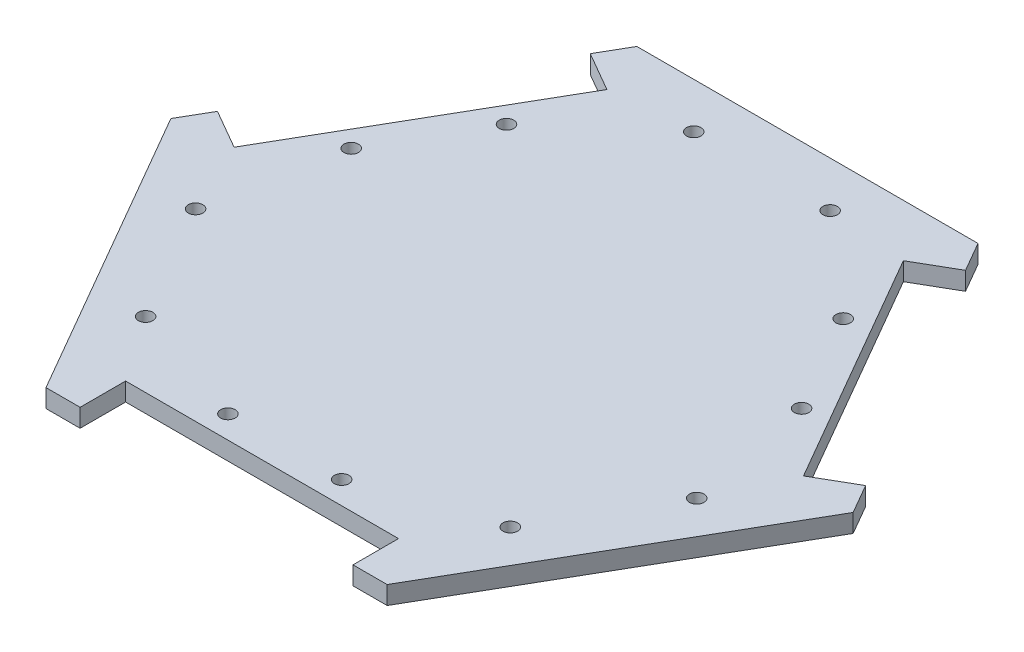
ISO-10303-21;
HEADER;
FILE_DESCRIPTION(('STEP AP214'),'2;1');
FILE_NAME('part.step','',(''),(''),'','','');
FILE_SCHEMA(('AUTOMOTIVE_DESIGN { 1 0 10303 214 1 1 1 1 }'));
ENDSEC;
DATA;
#1=APPLICATION_CONTEXT('core data for automotive mechanical design processes');
#2=APPLICATION_PROTOCOL_DEFINITION('international standard','automotive_design',2000,#1);
#3=PRODUCT_CONTEXT('',#1,'mechanical');
#4=PRODUCT('Part','Part','',(#3));
#5=PRODUCT_RELATED_PRODUCT_CATEGORY('part','',(#4));
#6=PRODUCT_DEFINITION_FORMATION('','',#4);
#7=PRODUCT_DEFINITION_CONTEXT('part definition',#1,'design');
#8=PRODUCT_DEFINITION('design','',#6,#7);
#9=PRODUCT_DEFINITION_SHAPE('','',#8);
#10=(LENGTH_UNIT() NAMED_UNIT(*) SI_UNIT(.MILLI.,.METRE.));
#11=(NAMED_UNIT(*) PLANE_ANGLE_UNIT() SI_UNIT($,.RADIAN.));
#12=(NAMED_UNIT(*) SI_UNIT($,.STERADIAN.) SOLID_ANGLE_UNIT());
#13=UNCERTAINTY_MEASURE_WITH_UNIT(LENGTH_MEASURE(1.E-05),#10,'distance_accuracy_value','');
#14=(GEOMETRIC_REPRESENTATION_CONTEXT(3) GLOBAL_UNCERTAINTY_ASSIGNED_CONTEXT((#13)) GLOBAL_UNIT_ASSIGNED_CONTEXT((#10,
#11,#12)) REPRESENTATION_CONTEXT('',''));
#15=CARTESIAN_POINT('',(0.,0.,0.));
#16=DIRECTION('',(0.,0.,1.));
#17=DIRECTION('',(1.,0.,0.));
#18=AXIS2_PLACEMENT_3D('',#15,#16,#17);
#19=CARTESIAN_POINT('',(0.,5.08,69.7889197104678));
#20=DIRECTION('',(0.,0.,1.));
#21=DIRECTION('',(1.,0.,0.));
#22=AXIS2_PLACEMENT_3D('',#19,#20,#21);
#23=PLANE('',#22);
#24=DIRECTION('',(-1.,0.,0.));
#25=VECTOR('',#24,1.);
#26=CARTESIAN_POINT('',(0.,0.,69.7889197104678));
#27=LINE('',#26,#25);
#28=CARTESIAN_POINT('',(38.1,0.,69.7889197104677));
#29=VERTEX_POINT('',#28);
#30=CARTESIAN_POINT('',(-38.1,0.,69.7889197104678));
#31=VERTEX_POINT('',#30);
#32=EDGE_CURVE('E235',#29,#31,#27,.T.);
#33=ORIENTED_EDGE('',*,*,#32,.F.);
#34=DIRECTION('',(0.,-1.,0.));
#35=VECTOR('',#34,1.);
#36=CARTESIAN_POINT('',(38.1,5.08,69.7889197104677));
#37=LINE('',#36,#35);
#38=CARTESIAN_POINT('',(38.1,5.08,69.7889197104677));
#39=VERTEX_POINT('',#38);
#40=EDGE_CURVE('E11',#39,#29,#37,.T.);
#41=ORIENTED_EDGE('',*,*,#40,.F.);
#42=DIRECTION('',(-1.,0.,0.));
#43=VECTOR('',#42,1.);
#44=CARTESIAN_POINT('',(0.,5.08,69.7889197104678));
#45=LINE('',#44,#43);
#46=CARTESIAN_POINT('',(-38.1,5.08,69.7889197104678));
#47=VERTEX_POINT('',#46);
#48=EDGE_CURVE('E439',#39,#47,#45,.T.);
#49=ORIENTED_EDGE('',*,*,#48,.T.);
#50=DIRECTION('',(0.,-1.,0.));
#51=VECTOR('',#50,1.);
#52=CARTESIAN_POINT('',(-38.1,5.08,69.7889197104678));
#53=LINE('',#52,#51);
#54=EDGE_CURVE('E52',#47,#31,#53,.T.);
#55=ORIENTED_EDGE('',*,*,#54,.T.);
#56=EDGE_LOOP('',(#33,#41,#49,#55));
#57=FACE_BOUND('',#56,.T.);
#58=ADVANCED_FACE('F35',(#57),#23,.T.);
#59=CARTESIAN_POINT('',(38.1,5.08,0.));
#60=DIRECTION('',(1.,0.,0.));
#61=DIRECTION('',(0.,0.,-1.));
#62=AXIS2_PLACEMENT_3D('',#59,#60,#61);
#63=PLANE('',#62);
#64=DIRECTION('',(0.,0.,1.));
#65=VECTOR('',#64,1.);
#66=CARTESIAN_POINT('',(38.1,0.,0.));
#67=LINE('',#66,#65);
#68=CARTESIAN_POINT('',(38.1,0.,82.4889197104678));
#69=VERTEX_POINT('',#68);
#70=EDGE_CURVE('E232',#29,#69,#67,.T.);
#71=ORIENTED_EDGE('',*,*,#70,.T.);
#72=DIRECTION('',(0.,-1.,0.));
#73=VECTOR('',#72,1.);
#74=CARTESIAN_POINT('',(38.1,5.08,82.4889197104678));
#75=LINE('',#74,#73);
#76=CARTESIAN_POINT('',(38.1,5.08,82.4889197104678));
#77=VERTEX_POINT('',#76);
#78=EDGE_CURVE('E44',#77,#69,#75,.T.);
#79=ORIENTED_EDGE('',*,*,#78,.F.);
#80=DIRECTION('',(0.,0.,1.));
#81=VECTOR('',#80,1.);
#82=CARTESIAN_POINT('',(38.1,5.08,0.));
#83=LINE('',#82,#81);
#84=EDGE_CURVE('E441',#39,#77,#83,.T.);
#85=ORIENTED_EDGE('',*,*,#84,.F.);
#86=ORIENTED_EDGE('',*,*,#40,.T.);
#87=EDGE_LOOP('',(#71,#79,#85,#86));
#88=FACE_BOUND('',#87,.T.);
#89=ADVANCED_FACE('F233',(#88),#63,.F.);
#90=CARTESIAN_POINT('',(0.,5.08,82.4889197104678));
#91=DIRECTION('',(0.,0.,-1.));
#92=DIRECTION('',(-1.,0.,0.));
#93=AXIS2_PLACEMENT_3D('',#90,#91,#92);
#94=PLANE('',#93);
#95=DIRECTION('',(1.,0.,0.));
#96=VECTOR('',#95,1.);
#97=CARTESIAN_POINT('',(0.,0.,82.4889197104678));
#98=LINE('',#97,#96);
#99=CARTESIAN_POINT('',(47.625,0.,82.4889197104678));
#100=VERTEX_POINT('',#99);
#101=EDGE_CURVE('E227',#69,#100,#98,.T.);
#102=ORIENTED_EDGE('',*,*,#101,.T.);
#103=DIRECTION('',(0.,-1.,0.));
#104=VECTOR('',#103,1.);
#105=CARTESIAN_POINT('',(47.625,5.08,82.4889197104678));
#106=LINE('',#105,#104);
#107=CARTESIAN_POINT('',(47.625,5.08,82.4889197104678));
#108=VERTEX_POINT('',#107);
#109=EDGE_CURVE('E218',#108,#100,#106,.T.);
#110=ORIENTED_EDGE('',*,*,#109,.F.);
#111=DIRECTION('',(1.,0.,0.));
#112=VECTOR('',#111,1.);
#113=CARTESIAN_POINT('',(0.,5.08,82.4889197104678));
#114=LINE('',#113,#112);
#115=EDGE_CURVE('E173',#77,#108,#114,.T.);
#116=ORIENTED_EDGE('',*,*,#115,.F.);
#117=ORIENTED_EDGE('',*,*,#78,.T.);
#118=EDGE_LOOP('',(#102,#110,#116,#117));
#119=FACE_BOUND('',#118,.T.);
#120=ADVANCED_FACE('F225',(#119),#94,.F.);
#121=CARTESIAN_POINT('',(71.4375,5.08,41.2444598552339));
#122=DIRECTION('',(-0.866025403784439,0.,-0.5));
#123=DIRECTION('',(-0.5,0.,0.866025403784439));
#124=AXIS2_PLACEMENT_3D('',#121,#122,#123);
#125=PLANE('',#124);
#126=DIRECTION('',(0.5,0.,-0.866025403784439));
#127=VECTOR('',#126,1.);
#128=CARTESIAN_POINT('',(71.4375,0.,41.2444598552339));
#129=LINE('',#128,#127);
#130=CARTESIAN_POINT('',(95.25,0.,0.));
#131=VERTEX_POINT('',#130);
#132=EDGE_CURVE('E237',#100,#131,#129,.T.);
#133=ORIENTED_EDGE('',*,*,#132,.T.);
#134=DIRECTION('',(0.,-1.,0.));
#135=VECTOR('',#134,1.);
#136=CARTESIAN_POINT('',(95.25,5.08,0.));
#137=LINE('',#136,#135);
#138=CARTESIAN_POINT('',(95.25,5.08,0.));
#139=VERTEX_POINT('',#138);
#140=EDGE_CURVE('E215',#139,#131,#137,.T.);
#141=ORIENTED_EDGE('',*,*,#140,.F.);
#142=DIRECTION('',(0.5,0.,-0.866025403784439));
#143=VECTOR('',#142,1.);
#144=CARTESIAN_POINT('',(71.4375,5.08,41.2444598552339));
#145=LINE('',#144,#143);
#146=EDGE_CURVE('E447',#108,#139,#145,.T.);
#147=ORIENTED_EDGE('',*,*,#146,.F.);
#148=ORIENTED_EDGE('',*,*,#109,.T.);
#149=EDGE_LOOP('',(#133,#141,#147,#148));
#150=FACE_BOUND('',#149,.T.);
#151=ADVANCED_FACE('F340',(#150),#125,.F.);
#152=CARTESIAN_POINT('',(71.4375,5.08,-41.2444598552339));
#153=DIRECTION('',(-0.866025403784439,0.,0.5));
#154=DIRECTION('',(0.5,0.,0.866025403784439));
#155=AXIS2_PLACEMENT_3D('',#152,#153,#154);
#156=PLANE('',#155);
#157=DIRECTION('',(-0.5,0.,-0.866025403784439));
#158=VECTOR('',#157,1.);
#159=CARTESIAN_POINT('',(71.4375,0.,-41.2444598552339));
#160=LINE('',#159,#158);
#161=CARTESIAN_POINT('',(90.4875,0.,-8.24889197104677));
#162=VERTEX_POINT('',#161);
#163=EDGE_CURVE('E246',#131,#162,#160,.T.);
#164=ORIENTED_EDGE('',*,*,#163,.T.);
#165=DIRECTION('',(0.,-1.,0.));
#166=VECTOR('',#165,1.);
#167=CARTESIAN_POINT('',(90.4875,5.08,-8.24889197104677));
#168=LINE('',#167,#166);
#169=CARTESIAN_POINT('',(90.4875,5.08,-8.24889197104677));
#170=VERTEX_POINT('',#169);
#171=EDGE_CURVE('E213',#170,#162,#168,.T.);
#172=ORIENTED_EDGE('',*,*,#171,.F.);
#173=DIRECTION('',(-0.5,0.,-0.866025403784439));
#174=VECTOR('',#173,1.);
#175=CARTESIAN_POINT('',(71.4375,5.08,-41.2444598552339));
#176=LINE('',#175,#174);
#177=EDGE_CURVE('E450',#139,#170,#176,.T.);
#178=ORIENTED_EDGE('',*,*,#177,.F.);
#179=ORIENTED_EDGE('',*,*,#140,.T.);
#180=EDGE_LOOP('',(#164,#172,#178,#179));
#181=FACE_BOUND('',#180,.T.);
#182=ADVANCED_FACE('F343',(#181),#156,.F.);
#183=CARTESIAN_POINT('',(19.05,5.08,32.9955678841871));
#184=DIRECTION('',(-0.5,0.,-0.866025403784439));
#185=DIRECTION('',(-0.866025403784439,0.,0.5));
#186=AXIS2_PLACEMENT_3D('',#183,#184,#185);
#187=PLANE('',#186);
#188=DIRECTION('',(0.866025403784439,0.,-0.5));
#189=VECTOR('',#188,1.);
#190=CARTESIAN_POINT('',(19.05,0.,32.9955678841871));
#191=LINE('',#190,#189);
#192=CARTESIAN_POINT('',(79.4889773719377,0.,-1.89889197104679));
#193=VERTEX_POINT('',#192);
#194=EDGE_CURVE('E249',#193,#162,#191,.T.);
#195=ORIENTED_EDGE('',*,*,#194,.F.);
#196=DIRECTION('',(0.,-1.,0.));
#197=VECTOR('',#196,1.);
#198=CARTESIAN_POINT('',(79.4889773719377,5.08,-1.89889197104679));
#199=LINE('',#198,#197);
#200=CARTESIAN_POINT('',(79.4889773719377,5.08,-1.89889197104679));
#201=VERTEX_POINT('',#200);
#202=EDGE_CURVE('E211',#201,#193,#199,.T.);
#203=ORIENTED_EDGE('',*,*,#202,.F.);
#204=DIRECTION('',(0.866025403784439,0.,-0.5));
#205=VECTOR('',#204,1.);
#206=CARTESIAN_POINT('',(19.05,5.08,32.9955678841871));
#207=LINE('',#206,#205);
#208=EDGE_CURVE('E452',#201,#170,#207,.T.);
#209=ORIENTED_EDGE('',*,*,#208,.T.);
#210=ORIENTED_EDGE('',*,*,#171,.T.);
#211=EDGE_LOOP('',(#195,#203,#209,#210));
#212=FACE_BOUND('',#211,.T.);
#213=ADVANCED_FACE('F345',(#212),#187,.T.);
#214=CARTESIAN_POINT('',(60.4389773719376,5.08,-34.894459855234));
#215=DIRECTION('',(0.866025403784438,0.,-0.500000000000001));
#216=DIRECTION('',(-0.500000000000001,0.,-0.866025403784438));
#217=AXIS2_PLACEMENT_3D('',#214,#215,#216);
#218=PLANE('',#217);
#219=DIRECTION('',(0.500000000000001,0.,0.866025403784438));
#220=VECTOR('',#219,1.);
#221=CARTESIAN_POINT('',(60.4389773719376,0.,-34.894459855234));
#222=LINE('',#221,#220);
#223=CARTESIAN_POINT('',(41.3889773719376,0.,-67.890027739421));
#224=VERTEX_POINT('',#223);
#225=EDGE_CURVE('E253',#224,#193,#222,.T.);
#226=ORIENTED_EDGE('',*,*,#225,.F.);
#227=DIRECTION('',(0.,-1.,0.));
#228=VECTOR('',#227,1.);
#229=CARTESIAN_POINT('',(41.3889773719376,5.08,-67.890027739421));
#230=LINE('',#229,#228);
#231=CARTESIAN_POINT('',(41.3889773719376,5.08,-67.890027739421));
#232=VERTEX_POINT('',#231);
#233=EDGE_CURVE('E209',#232,#224,#230,.T.);
#234=ORIENTED_EDGE('',*,*,#233,.F.);
#235=DIRECTION('',(0.500000000000001,0.,0.866025403784438));
#236=VECTOR('',#235,1.);
#237=CARTESIAN_POINT('',(60.4389773719376,5.08,-34.894459855234));
#238=LINE('',#237,#236);
#239=EDGE_CURVE('E456',#232,#201,#238,.T.);
#240=ORIENTED_EDGE('',*,*,#239,.T.);
#241=ORIENTED_EDGE('',*,*,#202,.T.);
#242=EDGE_LOOP('',(#226,#234,#240,#241));
#243=FACE_BOUND('',#242,.T.);
#244=ADVANCED_FACE('F348',(#243),#218,.T.);
#245=CARTESIAN_POINT('',(-19.05,5.08,-32.9955678841871));
#246=DIRECTION('',(-0.5,0.,-0.866025403784439));
#247=DIRECTION('',(-0.866025403784439,0.,0.5));
#248=AXIS2_PLACEMENT_3D('',#245,#246,#247);
#249=PLANE('',#248);
#250=DIRECTION('',(0.866025403784439,0.,-0.5));
#251=VECTOR('',#250,1.);
#252=CARTESIAN_POINT('',(-19.05,0.,-32.9955678841871));
#253=LINE('',#252,#251);
#254=CARTESIAN_POINT('',(52.3875,0.,-74.240027739421));
#255=VERTEX_POINT('',#254);
#256=EDGE_CURVE('E256',#224,#255,#253,.T.);
#257=ORIENTED_EDGE('',*,*,#256,.T.);
#258=DIRECTION('',(0.,-1.,0.));
#259=VECTOR('',#258,1.);
#260=CARTESIAN_POINT('',(52.3875,5.08,-74.240027739421));
#261=LINE('',#260,#259);
#262=CARTESIAN_POINT('',(52.3875,5.08,-74.240027739421));
#263=VERTEX_POINT('',#262);
#264=EDGE_CURVE('E206',#263,#255,#261,.T.);
#265=ORIENTED_EDGE('',*,*,#264,.F.);
#266=DIRECTION('',(0.866025403784439,0.,-0.5));
#267=VECTOR('',#266,1.);
#268=CARTESIAN_POINT('',(-19.05,5.08,-32.9955678841871));
#269=LINE('',#268,#267);
#270=EDGE_CURVE('E459',#232,#263,#269,.T.);
#271=ORIENTED_EDGE('',*,*,#270,.F.);
#272=ORIENTED_EDGE('',*,*,#233,.T.);
#273=EDGE_LOOP('',(#257,#265,#271,#272));
#274=FACE_BOUND('',#273,.T.);
#275=ADVANCED_FACE('F352',(#274),#249,.F.);
#276=CARTESIAN_POINT('',(47.625,0.,-82.4889197104678));
#277=VERTEX_POINT('',#276);
#278=EDGE_CURVE('E250',#255,#277,#160,.T.);
#279=ORIENTED_EDGE('',*,*,#278,.T.);
#280=DIRECTION('',(0.,-1.,0.));
#281=VECTOR('',#280,1.);
#282=CARTESIAN_POINT('',(47.625,5.08,-82.4889197104678));
#283=LINE('',#282,#281);
#284=CARTESIAN_POINT('',(47.625,5.08,-82.4889197104678));
#285=VERTEX_POINT('',#284);
#286=EDGE_CURVE('E203',#285,#277,#283,.T.);
#287=ORIENTED_EDGE('',*,*,#286,.F.);
#288=EDGE_CURVE('E453',#263,#285,#176,.T.);
#289=ORIENTED_EDGE('',*,*,#288,.F.);
#290=ORIENTED_EDGE('',*,*,#264,.T.);
#291=EDGE_LOOP('',(#279,#287,#289,#290));
#292=FACE_BOUND('',#291,.T.);
#293=ADVANCED_FACE('F356',(#292),#156,.F.);
#294=CARTESIAN_POINT('',(0.,5.08,-82.4889197104678));
#295=DIRECTION('',(0.,0.,1.));
#296=DIRECTION('',(1.,0.,0.));
#297=AXIS2_PLACEMENT_3D('',#294,#295,#296);
#298=PLANE('',#297);
#299=DIRECTION('',(-1.,0.,0.));
#300=VECTOR('',#299,1.);
#301=CARTESIAN_POINT('',(0.,0.,-82.4889197104678));
#302=LINE('',#301,#300);
#303=CARTESIAN_POINT('',(-47.625,0.,-82.4889197104678));
#304=VERTEX_POINT('',#303);
#305=EDGE_CURVE('E259',#277,#304,#302,.T.);
#306=ORIENTED_EDGE('',*,*,#305,.T.);
#307=DIRECTION('',(0.,-1.,0.));
#308=VECTOR('',#307,1.);
#309=CARTESIAN_POINT('',(-47.625,5.08,-82.4889197104678));
#310=LINE('',#309,#308);
#311=CARTESIAN_POINT('',(-47.625,5.08,-82.4889197104678));
#312=VERTEX_POINT('',#311);
#313=EDGE_CURVE('E200',#312,#304,#310,.T.);
#314=ORIENTED_EDGE('',*,*,#313,.F.);
#315=DIRECTION('',(-1.,0.,0.));
#316=VECTOR('',#315,1.);
#317=CARTESIAN_POINT('',(0.,5.08,-82.4889197104678));
#318=LINE('',#317,#316);
#319=EDGE_CURVE('E462',#285,#312,#318,.T.);
#320=ORIENTED_EDGE('',*,*,#319,.F.);
#321=ORIENTED_EDGE('',*,*,#286,.T.);
#322=EDGE_LOOP('',(#306,#314,#320,#321));
#323=FACE_BOUND('',#322,.T.);
#324=ADVANCED_FACE('F360',(#323),#298,.F.);
#325=CARTESIAN_POINT('',(-71.4375,5.08,-41.2444598552339));
#326=DIRECTION('',(0.866025403784438,0.,0.5));
#327=DIRECTION('',(0.5,0.,-0.866025403784439));
#328=AXIS2_PLACEMENT_3D('',#325,#326,#327);
#329=PLANE('',#328);
#330=DIRECTION('',(-0.5,0.,0.866025403784439));
#331=VECTOR('',#330,1.);
#332=CARTESIAN_POINT('',(-71.4375,0.,-41.2444598552339));
#333=LINE('',#332,#331);
#334=CARTESIAN_POINT('',(-52.3875,0.,-74.240027739421));
#335=VERTEX_POINT('',#334);
#336=EDGE_CURVE('E262',#304,#335,#333,.T.);
#337=ORIENTED_EDGE('',*,*,#336,.T.);
#338=DIRECTION('',(0.,-1.,0.));
#339=VECTOR('',#338,1.);
#340=CARTESIAN_POINT('',(-52.3875,5.08,-74.240027739421));
#341=LINE('',#340,#339);
#342=CARTESIAN_POINT('',(-52.3875,5.08,-74.240027739421));
#343=VERTEX_POINT('',#342);
#344=EDGE_CURVE('E198',#343,#335,#341,.T.);
#345=ORIENTED_EDGE('',*,*,#344,.F.);
#346=DIRECTION('',(-0.5,0.,0.866025403784439));
#347=VECTOR('',#346,1.);
#348=CARTESIAN_POINT('',(-71.4375,5.08,-41.2444598552339));
#349=LINE('',#348,#347);
#350=EDGE_CURVE('E465',#312,#343,#349,.T.);
#351=ORIENTED_EDGE('',*,*,#350,.F.);
#352=ORIENTED_EDGE('',*,*,#313,.T.);
#353=EDGE_LOOP('',(#337,#345,#351,#352));
#354=FACE_BOUND('',#353,.T.);
#355=ADVANCED_FACE('F364',(#354),#329,.F.);
#356=CARTESIAN_POINT('',(19.05,5.08,-32.9955678841871));
#357=DIRECTION('',(-0.5,0.,0.866025403784438));
#358=DIRECTION('',(0.866025403784439,0.,0.5));
#359=AXIS2_PLACEMENT_3D('',#356,#357,#358);
#360=PLANE('',#359);
#361=DIRECTION('',(-0.866025403784439,0.,-0.5));
#362=VECTOR('',#361,1.);
#363=CARTESIAN_POINT('',(19.05,0.,-32.9955678841871));
#364=LINE('',#363,#362);
#365=CARTESIAN_POINT('',(-41.3889773719376,0.,-67.890027739421));
#366=VERTEX_POINT('',#365);
#367=EDGE_CURVE('E265',#366,#335,#364,.T.);
#368=ORIENTED_EDGE('',*,*,#367,.F.);
#369=DIRECTION('',(0.,-1.,0.));
#370=VECTOR('',#369,1.);
#371=CARTESIAN_POINT('',(-41.3889773719376,5.08,-67.890027739421));
#372=LINE('',#371,#370);
#373=CARTESIAN_POINT('',(-41.3889773719376,5.08,-67.890027739421));
#374=VERTEX_POINT('',#373);
#375=EDGE_CURVE('E196',#374,#366,#372,.T.);
#376=ORIENTED_EDGE('',*,*,#375,.F.);
#377=DIRECTION('',(-0.866025403784439,0.,-0.5));
#378=VECTOR('',#377,1.);
#379=CARTESIAN_POINT('',(19.05,5.08,-32.9955678841871));
#380=LINE('',#379,#378);
#381=EDGE_CURVE('E467',#374,#343,#380,.T.);
#382=ORIENTED_EDGE('',*,*,#381,.T.);
#383=ORIENTED_EDGE('',*,*,#344,.T.);
#384=EDGE_LOOP('',(#368,#376,#382,#383));
#385=FACE_BOUND('',#384,.T.);
#386=ADVANCED_FACE('F366',(#385),#360,.T.);
#387=CARTESIAN_POINT('',(-60.4389773719376,5.08,-34.8944598552339));
#388=DIRECTION('',(-0.866025403784439,0.,-0.5));
#389=DIRECTION('',(-0.5,0.,0.866025403784439));
#390=AXIS2_PLACEMENT_3D('',#387,#388,#389);
#391=PLANE('',#390);
#392=DIRECTION('',(0.5,0.,-0.866025403784439));
#393=VECTOR('',#392,1.);
#394=CARTESIAN_POINT('',(-60.4389773719376,0.,-34.8944598552339));
#395=LINE('',#394,#393);
#396=CARTESIAN_POINT('',(-79.4889773719376,0.,-1.89889197104678));
#397=VERTEX_POINT('',#396);
#398=EDGE_CURVE('E269',#397,#366,#395,.T.);
#399=ORIENTED_EDGE('',*,*,#398,.F.);
#400=DIRECTION('',(0.,-1.,0.));
#401=VECTOR('',#400,1.);
#402=CARTESIAN_POINT('',(-79.4889773719376,5.08,-1.89889197104678));
#403=LINE('',#402,#401);
#404=CARTESIAN_POINT('',(-79.4889773719376,5.08,-1.89889197104678));
#405=VERTEX_POINT('',#404);
#406=EDGE_CURVE('E194',#405,#397,#403,.T.);
#407=ORIENTED_EDGE('',*,*,#406,.F.);
#408=DIRECTION('',(0.5,0.,-0.866025403784439));
#409=VECTOR('',#408,1.);
#410=CARTESIAN_POINT('',(-60.4389773719376,5.08,-34.8944598552339));
#411=LINE('',#410,#409);
#412=EDGE_CURVE('E470',#405,#374,#411,.T.);
#413=ORIENTED_EDGE('',*,*,#412,.T.);
#414=ORIENTED_EDGE('',*,*,#375,.T.);
#415=EDGE_LOOP('',(#399,#407,#413,#414));
#416=FACE_BOUND('',#415,.T.);
#417=ADVANCED_FACE('F369',(#416),#391,.T.);
#418=CARTESIAN_POINT('',(-19.05,5.08,32.9955678841871));
#419=DIRECTION('',(-0.5,0.,0.866025403784438));
#420=DIRECTION('',(0.866025403784438,0.,0.5));
#421=AXIS2_PLACEMENT_3D('',#418,#419,#420);
#422=PLANE('',#421);
#423=DIRECTION('',(-0.866025403784438,0.,-0.5));
#424=VECTOR('',#423,1.);
#425=CARTESIAN_POINT('',(-19.05,0.,32.9955678841871));
#426=LINE('',#425,#424);
#427=CARTESIAN_POINT('',(-90.4875,0.,-8.24889197104679));
#428=VERTEX_POINT('',#427);
#429=EDGE_CURVE('E272',#397,#428,#426,.T.);
#430=ORIENTED_EDGE('',*,*,#429,.T.);
#431=DIRECTION('',(0.,-1.,0.));
#432=VECTOR('',#431,1.);
#433=CARTESIAN_POINT('',(-90.4875,5.08,-8.24889197104679));
#434=LINE('',#433,#432);
#435=CARTESIAN_POINT('',(-90.4875,5.08,-8.24889197104679));
#436=VERTEX_POINT('',#435);
#437=EDGE_CURVE('E187',#436,#428,#434,.T.);
#438=ORIENTED_EDGE('',*,*,#437,.F.);
#439=DIRECTION('',(-0.866025403784438,0.,-0.5));
#440=VECTOR('',#439,1.);
#441=CARTESIAN_POINT('',(-19.05,5.08,32.9955678841871));
#442=LINE('',#441,#440);
#443=EDGE_CURVE('E472',#405,#436,#442,.T.);
#444=ORIENTED_EDGE('',*,*,#443,.F.);
#445=ORIENTED_EDGE('',*,*,#406,.T.);
#446=EDGE_LOOP('',(#430,#438,#444,#445));
#447=FACE_BOUND('',#446,.T.);
#448=ADVANCED_FACE('F373',(#447),#422,.F.);
#449=CARTESIAN_POINT('',(-95.25,0.,0.));
#450=VERTEX_POINT('',#449);
#451=EDGE_CURVE('E266',#428,#450,#333,.T.);
#452=ORIENTED_EDGE('',*,*,#451,.T.);
#453=DIRECTION('',(0.,-1.,0.));
#454=VECTOR('',#453,1.);
#455=CARTESIAN_POINT('',(-95.25,5.08,0.));
#456=LINE('',#455,#454);
#457=CARTESIAN_POINT('',(-95.25,5.08,0.));
#458=VERTEX_POINT('',#457);
#459=EDGE_CURVE('E185',#458,#450,#456,.T.);
#460=ORIENTED_EDGE('',*,*,#459,.F.);
#461=EDGE_CURVE('E178',#436,#458,#349,.T.);
#462=ORIENTED_EDGE('',*,*,#461,.F.);
#463=ORIENTED_EDGE('',*,*,#437,.T.);
#464=EDGE_LOOP('',(#452,#460,#462,#463));
#465=FACE_BOUND('',#464,.T.);
#466=ADVANCED_FACE('F377',(#465),#329,.F.);
#467=CARTESIAN_POINT('',(-71.4375,5.08,41.2444598552339));
#468=DIRECTION('',(0.866025403784439,0.,-0.5));
#469=DIRECTION('',(-0.5,0.,-0.866025403784439));
#470=AXIS2_PLACEMENT_3D('',#467,#468,#469);
#471=PLANE('',#470);
#472=DIRECTION('',(0.5,0.,0.866025403784439));
#473=VECTOR('',#472,1.);
#474=CARTESIAN_POINT('',(-71.4375,0.,41.2444598552339));
#475=LINE('',#474,#473);
#476=CARTESIAN_POINT('',(-47.625,0.,82.4889197104678));
#477=VERTEX_POINT('',#476);
#478=EDGE_CURVE('E184',#450,#477,#475,.T.);
#479=ORIENTED_EDGE('',*,*,#478,.T.);
#480=DIRECTION('',(0.,-1.,0.));
#481=VECTOR('',#480,1.);
#482=CARTESIAN_POINT('',(-47.625,5.08,82.4889197104678));
#483=LINE('',#482,#481);
#484=CARTESIAN_POINT('',(-47.625,5.08,82.4889197104678));
#485=VERTEX_POINT('',#484);
#486=EDGE_CURVE('E166',#485,#477,#483,.T.);
#487=ORIENTED_EDGE('',*,*,#486,.F.);
#488=DIRECTION('',(0.5,0.,0.866025403784439));
#489=VECTOR('',#488,1.);
#490=CARTESIAN_POINT('',(-71.4375,5.08,41.2444598552339));
#491=LINE('',#490,#489);
#492=EDGE_CURVE('E171',#458,#485,#491,.T.);
#493=ORIENTED_EDGE('',*,*,#492,.F.);
#494=ORIENTED_EDGE('',*,*,#459,.T.);
#495=EDGE_LOOP('',(#479,#487,#493,#494));
#496=FACE_BOUND('',#495,.T.);
#497=ADVANCED_FACE('F183',(#496),#471,.F.);
#498=CARTESIAN_POINT('',(-38.1,0.,82.4889197104678));
#499=VERTEX_POINT('',#498);
#500=EDGE_CURVE('E239',#477,#499,#98,.T.);
#501=ORIENTED_EDGE('',*,*,#500,.T.);
#502=DIRECTION('',(0.,-1.,0.));
#503=VECTOR('',#502,1.);
#504=CARTESIAN_POINT('',(-38.1,5.08,82.4889197104678));
#505=LINE('',#504,#503);
#506=CARTESIAN_POINT('',(-38.1,5.08,82.4889197104678));
#507=VERTEX_POINT('',#506);
#508=EDGE_CURVE('E108',#507,#499,#505,.T.);
#509=ORIENTED_EDGE('',*,*,#508,.F.);
#510=EDGE_CURVE('E162',#485,#507,#114,.T.);
#511=ORIENTED_EDGE('',*,*,#510,.F.);
#512=ORIENTED_EDGE('',*,*,#486,.T.);
#513=EDGE_LOOP('',(#501,#509,#511,#512));
#514=FACE_BOUND('',#513,.T.);
#515=ADVANCED_FACE('F164',(#514),#94,.F.);
#516=CARTESIAN_POINT('',(-62.8772160579064,5.08,-17.971306570156));
#517=DIRECTION('',(0.,-1.,0.));
#518=DIRECTION('',(0.,0.,-1.));
#519=AXIS2_PLACEMENT_3D('',#516,#517,#518);
#520=CYLINDRICAL_SURFACE('',#519,2.03199999999999);
#521=CARTESIAN_POINT('',(-62.8772160579064,5.08,-17.971306570156));
#522=DIRECTION('',(0.,1.,0.));
#523=DIRECTION('',(0.,0.,1.));
#524=AXIS2_PLACEMENT_3D('',#521,#522,#523);
#525=CIRCLE('',#524,2.03199999999999);
#526=CARTESIAN_POINT('',(-62.8772160579064,5.08,-15.939306570156));
#527=VERTEX_POINT('',#526);
#528=EDGE_CURVE('E438',#527,#527,#525,.T.);
#529=ORIENTED_EDGE('',*,*,#528,.T.);
#530=EDGE_LOOP('',(#529));
#531=FACE_BOUND('',#530,.T.);
#532=CARTESIAN_POINT('',(-62.8772160579064,0.,-17.971306570156));
#533=DIRECTION('',(0.,1.,0.));
#534=DIRECTION('',(0.,0.,1.));
#535=AXIS2_PLACEMENT_3D('',#532,#533,#534);
#536=CIRCLE('',#535,2.03199999999999);
#537=CARTESIAN_POINT('',(-62.8772160579064,0.,-15.939306570156));
#538=VERTEX_POINT('',#537);
#539=EDGE_CURVE('E240',#538,#538,#536,.T.);
#540=ORIENTED_EDGE('',*,*,#539,.F.);
#541=EDGE_LOOP('',(#540));
#542=FACE_BOUND('',#541,.T.);
#543=ADVANCED_FACE('F319',(#531,#542),#520,.F.);
#544=CARTESIAN_POINT('',(-47.0022160579064,5.08,-45.4676131403119));
#545=DIRECTION('',(0.,-1.,0.));
#546=DIRECTION('',(0.,0.,-1.));
#547=AXIS2_PLACEMENT_3D('',#544,#545,#546);
#548=CYLINDRICAL_SURFACE('',#547,2.032);
#549=CARTESIAN_POINT('',(-47.0022160579064,5.08,-45.4676131403119));
#550=DIRECTION('',(0.,1.,0.));
#551=DIRECTION('',(0.,0.,1.));
#552=AXIS2_PLACEMENT_3D('',#549,#550,#551);
#553=CIRCLE('',#552,2.032);
#554=CARTESIAN_POINT('',(-47.0022160579064,5.08,-43.4356131403119));
#555=VERTEX_POINT('',#554);
#556=EDGE_CURVE('E436',#555,#555,#553,.T.);
#557=ORIENTED_EDGE('',*,*,#556,.T.);
#558=EDGE_LOOP('',(#557));
#559=FACE_BOUND('',#558,.T.);
#560=CARTESIAN_POINT('',(-47.0022160579064,0.,-45.4676131403119));
#561=DIRECTION('',(0.,1.,0.));
#562=DIRECTION('',(0.,0.,1.));
#563=AXIS2_PLACEMENT_3D('',#560,#561,#562);
#564=CIRCLE('',#563,2.032);
#565=CARTESIAN_POINT('',(-47.0022160579064,0.,-43.4356131403119));
#566=VERTEX_POINT('',#565);
#567=EDGE_CURVE('E312',#566,#566,#564,.T.);
#568=ORIENTED_EDGE('',*,*,#567,.F.);
#569=EDGE_LOOP('',(#568));
#570=FACE_BOUND('',#569,.T.);
#571=ADVANCED_FACE('F321',(#559,#570),#548,.F.);
#572=CARTESIAN_POINT('',(62.8772160579065,5.08,-17.9713065701559));
#573=DIRECTION('',(0.,-1.,0.));
#574=DIRECTION('',(0.,0.,-1.));
#575=AXIS2_PLACEMENT_3D('',#572,#573,#574);
#576=CYLINDRICAL_SURFACE('',#575,2.03200000000001);
#577=CARTESIAN_POINT('',(62.8772160579065,5.08,-17.9713065701559));
#578=DIRECTION('',(0.,1.,0.));
#579=DIRECTION('',(0.,0.,1.));
#580=AXIS2_PLACEMENT_3D('',#577,#578,#579);
#581=CIRCLE('',#580,2.03200000000001);
#582=CARTESIAN_POINT('',(62.8772160579065,5.08,-15.9393065701559));
#583=VERTEX_POINT('',#582);
#584=EDGE_CURVE('E432',#583,#583,#581,.T.);
#585=ORIENTED_EDGE('',*,*,#584,.T.);
#586=EDGE_LOOP('',(#585));
#587=FACE_BOUND('',#586,.T.);
#588=CARTESIAN_POINT('',(62.8772160579065,0.,-17.9713065701559));
#589=DIRECTION('',(0.,1.,0.));
#590=DIRECTION('',(0.,0.,1.));
#591=AXIS2_PLACEMENT_3D('',#588,#589,#590);
#592=CIRCLE('',#591,2.03200000000001);
#593=CARTESIAN_POINT('',(62.8772160579065,0.,-15.9393065701559));
#594=VERTEX_POINT('',#593);
#595=EDGE_CURVE('E309',#594,#594,#592,.T.);
#596=ORIENTED_EDGE('',*,*,#595,.F.);
#597=EDGE_LOOP('',(#596));
#598=FACE_BOUND('',#597,.T.);
#599=ADVANCED_FACE('F328',(#587,#598),#576,.F.);
#600=CARTESIAN_POINT('',(47.0022160579065,5.08,-45.4676131403119));
#601=DIRECTION('',(0.,-1.,0.));
#602=DIRECTION('',(0.,0.,-1.));
#603=AXIS2_PLACEMENT_3D('',#600,#601,#602);
#604=CYLINDRICAL_SURFACE('',#603,2.032);
#605=CARTESIAN_POINT('',(47.0022160579065,5.08,-45.4676131403119));
#606=DIRECTION('',(0.,1.,0.));
#607=DIRECTION('',(0.,0.,1.));
#608=AXIS2_PLACEMENT_3D('',#605,#606,#607);
#609=CIRCLE('',#608,2.032);
#610=CARTESIAN_POINT('',(47.0022160579065,5.08,-43.4356131403119));
#611=VERTEX_POINT('',#610);
#612=EDGE_CURVE('E428',#611,#611,#609,.T.);
#613=ORIENTED_EDGE('',*,*,#612,.T.);
#614=EDGE_LOOP('',(#613));
#615=FACE_BOUND('',#614,.T.);
#616=CARTESIAN_POINT('',(47.0022160579065,0.,-45.4676131403119));
#617=DIRECTION('',(0.,1.,0.));
#618=DIRECTION('',(0.,0.,1.));
#619=AXIS2_PLACEMENT_3D('',#616,#617,#618);
#620=CIRCLE('',#619,2.032);
#621=CARTESIAN_POINT('',(47.0022160579065,0.,-43.4356131403119));
#622=VERTEX_POINT('',#621);
#623=EDGE_CURVE('E306',#622,#622,#620,.T.);
#624=ORIENTED_EDGE('',*,*,#623,.F.);
#625=EDGE_LOOP('',(#624));
#626=FACE_BOUND('',#625,.T.);
#627=ADVANCED_FACE('F571',(#615,#626),#604,.F.);
#628=CARTESIAN_POINT('',(-15.875,5.08,63.4389197104678));
#629=DIRECTION('',(0.,-1.,0.));
#630=DIRECTION('',(0.,0.,-1.));
#631=AXIS2_PLACEMENT_3D('',#628,#629,#630);
#632=CYLINDRICAL_SURFACE('',#631,2.03200000000001);
#633=CARTESIAN_POINT('',(-15.875,5.08,63.4389197104678));
#634=DIRECTION('',(0.,1.,0.));
#635=DIRECTION('',(0.,0.,1.));
#636=AXIS2_PLACEMENT_3D('',#633,#634,#635);
#637=CIRCLE('',#636,2.03200000000001);
#638=CARTESIAN_POINT('',(-15.875,5.08,65.4709197104678));
#639=VERTEX_POINT('',#638);
#640=EDGE_CURVE('E424',#639,#639,#637,.T.);
#641=ORIENTED_EDGE('',*,*,#640,.T.);
#642=EDGE_LOOP('',(#641));
#643=FACE_BOUND('',#642,.T.);
#644=CARTESIAN_POINT('',(-15.875,0.,63.4389197104678));
#645=DIRECTION('',(0.,1.,0.));
#646=DIRECTION('',(0.,0.,1.));
#647=AXIS2_PLACEMENT_3D('',#644,#645,#646);
#648=CIRCLE('',#647,2.03200000000001);
#649=CARTESIAN_POINT('',(-15.875,0.,65.4709197104678));
#650=VERTEX_POINT('',#649);
#651=EDGE_CURVE('E303',#650,#650,#648,.T.);
#652=ORIENTED_EDGE('',*,*,#651,.F.);
#653=EDGE_LOOP('',(#652));
#654=FACE_BOUND('',#653,.T.);
#655=ADVANCED_FACE('F581',(#643,#654),#632,.F.);
#656=CARTESIAN_POINT('',(15.875,5.08,63.4389197104678));
#657=DIRECTION('',(0.,-1.,0.));
#658=DIRECTION('',(0.,0.,-1.));
#659=AXIS2_PLACEMENT_3D('',#656,#657,#658);
#660=CYLINDRICAL_SURFACE('',#659,2.03200000000001);
#661=CARTESIAN_POINT('',(15.875,5.08,63.4389197104678));
#662=DIRECTION('',(0.,1.,0.));
#663=DIRECTION('',(0.,0.,1.));
#664=AXIS2_PLACEMENT_3D('',#661,#662,#663);
#665=CIRCLE('',#664,2.03200000000001);
#666=CARTESIAN_POINT('',(15.875,5.08,65.4709197104678));
#667=VERTEX_POINT('',#666);
#668=EDGE_CURVE('E420',#667,#667,#665,.T.);
#669=ORIENTED_EDGE('',*,*,#668,.T.);
#670=EDGE_LOOP('',(#669));
#671=FACE_BOUND('',#670,.T.);
#672=CARTESIAN_POINT('',(15.875,0.,63.4389197104678));
#673=DIRECTION('',(0.,1.,0.));
#674=DIRECTION('',(0.,0.,1.));
#675=AXIS2_PLACEMENT_3D('',#672,#673,#674);
#676=CIRCLE('',#675,2.03200000000001);
#677=CARTESIAN_POINT('',(15.875,0.,65.4709197104678));
#678=VERTEX_POINT('',#677);
#679=EDGE_CURVE('E300',#678,#678,#676,.T.);
#680=ORIENTED_EDGE('',*,*,#679,.F.);
#681=EDGE_LOOP('',(#680));
#682=FACE_BOUND('',#681,.T.);
#683=ADVANCED_FACE('F591',(#671,#682),#660,.F.);
#684=CARTESIAN_POINT('',(-69.9639773719376,5.08,18.3966759131403));
#685=DIRECTION('',(0.,-1.,0.));
#686=DIRECTION('',(0.,0.,-1.));
#687=AXIS2_PLACEMENT_3D('',#684,#685,#686);
#688=CYLINDRICAL_SURFACE('',#687,2.03200000000001);
#689=CARTESIAN_POINT('',(-69.9639773719376,5.08,18.3966759131403));
#690=DIRECTION('',(0.,1.,0.));
#691=DIRECTION('',(0.,0.,1.));
#692=AXIS2_PLACEMENT_3D('',#689,#690,#691);
#693=CIRCLE('',#692,2.03200000000001);
#694=CARTESIAN_POINT('',(-69.9639773719376,5.08,20.4286759131403));
#695=VERTEX_POINT('',#694);
#696=EDGE_CURVE('E416',#695,#695,#693,.T.);
#697=ORIENTED_EDGE('',*,*,#696,.T.);
#698=EDGE_LOOP('',(#697));
#699=FACE_BOUND('',#698,.T.);
#700=CARTESIAN_POINT('',(-69.9639773719376,0.,18.3966759131403));
#701=DIRECTION('',(0.,1.,0.));
#702=DIRECTION('',(0.,0.,1.));
#703=AXIS2_PLACEMENT_3D('',#700,#701,#702);
#704=CIRCLE('',#703,2.03200000000001);
#705=CARTESIAN_POINT('',(-69.9639773719376,0.,20.4286759131403));
#706=VERTEX_POINT('',#705);
#707=EDGE_CURVE('E297',#706,#706,#704,.T.);
#708=ORIENTED_EDGE('',*,*,#707,.F.);
#709=EDGE_LOOP('',(#708));
#710=FACE_BOUND('',#709,.T.);
#711=ADVANCED_FACE('F601',(#699,#710),#688,.F.);
#712=CARTESIAN_POINT('',(-50.9139773719376,5.08,51.3922437973274));
#713=DIRECTION('',(0.,-1.,0.));
#714=DIRECTION('',(0.,0.,-1.));
#715=AXIS2_PLACEMENT_3D('',#712,#713,#714);
#716=CYLINDRICAL_SURFACE('',#715,2.032);
#717=CARTESIAN_POINT('',(-50.9139773719376,5.08,51.3922437973274));
#718=DIRECTION('',(0.,1.,0.));
#719=DIRECTION('',(0.,0.,1.));
#720=AXIS2_PLACEMENT_3D('',#717,#718,#719);
#721=CIRCLE('',#720,2.032);
#722=CARTESIAN_POINT('',(-50.9139773719376,5.08,53.4242437973274));
#723=VERTEX_POINT('',#722);
#724=EDGE_CURVE('E412',#723,#723,#721,.T.);
#725=ORIENTED_EDGE('',*,*,#724,.T.);
#726=EDGE_LOOP('',(#725));
#727=FACE_BOUND('',#726,.T.);
#728=CARTESIAN_POINT('',(-50.9139773719376,0.,51.3922437973274));
#729=DIRECTION('',(0.,1.,0.));
#730=DIRECTION('',(0.,0.,1.));
#731=AXIS2_PLACEMENT_3D('',#728,#729,#730);
#732=CIRCLE('',#731,2.032);
#733=CARTESIAN_POINT('',(-50.9139773719376,0.,53.4242437973274));
#734=VERTEX_POINT('',#733);
#735=EDGE_CURVE('E294',#734,#734,#732,.T.);
#736=ORIENTED_EDGE('',*,*,#735,.F.);
#737=EDGE_LOOP('',(#736));
#738=FACE_BOUND('',#737,.T.);
#739=ADVANCED_FACE('F611',(#727,#738),#716,.F.);
#740=CARTESIAN_POINT('',(19.0500000000003,5.08,-69.7889197104677));
#741=DIRECTION('',(0.,-1.,0.));
#742=DIRECTION('',(0.,0.,-1.));
#743=AXIS2_PLACEMENT_3D('',#740,#741,#742);
#744=CYLINDRICAL_SURFACE('',#743,2.03200000000001);
#745=CARTESIAN_POINT('',(19.0500000000003,5.08,-69.7889197104677));
#746=DIRECTION('',(0.,1.,0.));
#747=DIRECTION('',(0.,0.,1.));
#748=AXIS2_PLACEMENT_3D('',#745,#746,#747);
#749=CIRCLE('',#748,2.03200000000001);
#750=CARTESIAN_POINT('',(19.0500000000003,5.08,-67.7569197104677));
#751=VERTEX_POINT('',#750);
#752=EDGE_CURVE('E408',#751,#751,#749,.T.);
#753=ORIENTED_EDGE('',*,*,#752,.T.);
#754=EDGE_LOOP('',(#753));
#755=FACE_BOUND('',#754,.T.);
#756=CARTESIAN_POINT('',(19.0500000000003,0.,-69.7889197104677));
#757=DIRECTION('',(0.,1.,0.));
#758=DIRECTION('',(0.,0.,1.));
#759=AXIS2_PLACEMENT_3D('',#756,#757,#758);
#760=CIRCLE('',#759,2.03200000000001);
#761=CARTESIAN_POINT('',(19.0500000000003,0.,-67.7569197104677));
#762=VERTEX_POINT('',#761);
#763=EDGE_CURVE('E291',#762,#762,#760,.T.);
#764=ORIENTED_EDGE('',*,*,#763,.F.);
#765=EDGE_LOOP('',(#764));
#766=FACE_BOUND('',#765,.T.);
#767=ADVANCED_FACE('F621',(#755,#766),#744,.F.);
#768=CARTESIAN_POINT('',(-19.0499999999996,5.08,-69.7889197104679));
#769=DIRECTION('',(0.,-1.,0.));
#770=DIRECTION('',(0.,0.,-1.));
#771=AXIS2_PLACEMENT_3D('',#768,#769,#770);
#772=CYLINDRICAL_SURFACE('',#771,2.032);
#773=CARTESIAN_POINT('',(-19.0499999999996,5.08,-69.7889197104679));
#774=DIRECTION('',(0.,1.,0.));
#775=DIRECTION('',(0.,0.,1.));
#776=AXIS2_PLACEMENT_3D('',#773,#774,#775);
#777=CIRCLE('',#776,2.032);
#778=CARTESIAN_POINT('',(-19.0499999999996,5.08,-67.7569197104679));
#779=VERTEX_POINT('',#778);
#780=EDGE_CURVE('E404',#779,#779,#777,.T.);
#781=ORIENTED_EDGE('',*,*,#780,.T.);
#782=EDGE_LOOP('',(#781));
#783=FACE_BOUND('',#782,.T.);
#784=CARTESIAN_POINT('',(-19.0499999999996,0.,-69.7889197104679));
#785=DIRECTION('',(0.,1.,0.));
#786=DIRECTION('',(0.,0.,1.));
#787=AXIS2_PLACEMENT_3D('',#784,#785,#786);
#788=CIRCLE('',#787,2.032);
#789=CARTESIAN_POINT('',(-19.0499999999996,0.,-67.7569197104679));
#790=VERTEX_POINT('',#789);
#791=EDGE_CURVE('E288',#790,#790,#788,.T.);
#792=ORIENTED_EDGE('',*,*,#791,.F.);
#793=EDGE_LOOP('',(#792));
#794=FACE_BOUND('',#793,.T.);
#795=ADVANCED_FACE('F631',(#783,#794),#772,.F.);
#796=CARTESIAN_POINT('',(50.9139773719371,5.08,51.3922437973279));
#797=DIRECTION('',(0.,-1.,0.));
#798=DIRECTION('',(0.,0.,-1.));
#799=AXIS2_PLACEMENT_3D('',#796,#797,#798);
#800=CYLINDRICAL_SURFACE('',#799,2.03200000000001);
#801=CARTESIAN_POINT('',(50.9139773719371,5.08,51.3922437973279));
#802=DIRECTION('',(0.,1.,0.));
#803=DIRECTION('',(0.,0.,1.));
#804=AXIS2_PLACEMENT_3D('',#801,#802,#803);
#805=CIRCLE('',#804,2.03200000000001);
#806=CARTESIAN_POINT('',(50.9139773719371,5.08,53.4242437973279));
#807=VERTEX_POINT('',#806);
#808=EDGE_CURVE('E400',#807,#807,#805,.T.);
#809=ORIENTED_EDGE('',*,*,#808,.T.);
#810=EDGE_LOOP('',(#809));
#811=FACE_BOUND('',#810,.T.);
#812=CARTESIAN_POINT('',(50.9139773719371,0.,51.3922437973279));
#813=DIRECTION('',(0.,1.,0.));
#814=DIRECTION('',(0.,0.,1.));
#815=AXIS2_PLACEMENT_3D('',#812,#813,#814);
#816=CIRCLE('',#815,2.03200000000001);
#817=CARTESIAN_POINT('',(50.9139773719371,0.,53.4242437973279));
#818=VERTEX_POINT('',#817);
#819=EDGE_CURVE('E285',#818,#818,#816,.T.);
#820=ORIENTED_EDGE('',*,*,#819,.F.);
#821=EDGE_LOOP('',(#820));
#822=FACE_BOUND('',#821,.T.);
#823=ADVANCED_FACE('F641',(#811,#822),#800,.F.);
#824=CARTESIAN_POINT('',(69.9639773719374,5.08,18.396675913141));
#825=DIRECTION('',(0.,-1.,0.));
#826=DIRECTION('',(0.,0.,-1.));
#827=AXIS2_PLACEMENT_3D('',#824,#825,#826);
#828=CYLINDRICAL_SURFACE('',#827,2.03200000000001);
#829=CARTESIAN_POINT('',(69.9639773719374,5.08,18.396675913141));
#830=DIRECTION('',(0.,1.,0.));
#831=DIRECTION('',(0.,0.,1.));
#832=AXIS2_PLACEMENT_3D('',#829,#830,#831);
#833=CIRCLE('',#832,2.03200000000001);
#834=CARTESIAN_POINT('',(69.9639773719374,5.08,20.428675913141));
#835=VERTEX_POINT('',#834);
#836=EDGE_CURVE('E278',#835,#835,#833,.T.);
#837=ORIENTED_EDGE('',*,*,#836,.T.);
#838=EDGE_LOOP('',(#837));
#839=FACE_BOUND('',#838,.T.);
#840=CARTESIAN_POINT('',(69.9639773719374,0.,18.396675913141));
#841=DIRECTION('',(0.,1.,0.));
#842=DIRECTION('',(0.,0.,1.));
#843=AXIS2_PLACEMENT_3D('',#840,#841,#842);
#844=CIRCLE('',#843,2.03200000000001);
#845=CARTESIAN_POINT('',(69.9639773719374,0.,20.428675913141));
#846=VERTEX_POINT('',#845);
#847=EDGE_CURVE('E282',#846,#846,#844,.T.);
#848=ORIENTED_EDGE('',*,*,#847,.F.);
#849=EDGE_LOOP('',(#848));
#850=FACE_BOUND('',#849,.T.);
#851=ADVANCED_FACE('F37',(#839,#850),#828,.F.);
#852=CARTESIAN_POINT('',(-38.1,5.08,0.));
#853=DIRECTION('',(1.,0.,0.));
#854=DIRECTION('',(0.,0.,-1.));
#855=AXIS2_PLACEMENT_3D('',#852,#853,#854);
#856=PLANE('',#855);
#857=DIRECTION('',(0.,0.,1.));
#858=VECTOR('',#857,1.);
#859=CARTESIAN_POINT('',(-38.1,0.,0.));
#860=LINE('',#859,#858);
#861=EDGE_CURVE('E276',#31,#499,#860,.T.);
#862=ORIENTED_EDGE('',*,*,#861,.F.);
#863=ORIENTED_EDGE('',*,*,#54,.F.);
#864=DIRECTION('',(0.,0.,1.));
#865=VECTOR('',#864,1.);
#866=CARTESIAN_POINT('',(-38.1,5.08,0.));
#867=LINE('',#866,#865);
#868=EDGE_CURVE('E170',#47,#507,#867,.T.);
#869=ORIENTED_EDGE('',*,*,#868,.T.);
#870=ORIENTED_EDGE('',*,*,#508,.T.);
#871=EDGE_LOOP('',(#862,#863,#869,#870));
#872=FACE_BOUND('',#871,.T.);
#873=ADVANCED_FACE('F384',(#872),#856,.T.);
#874=CARTESIAN_POINT('',(0.,5.08,0.));
#875=DIRECTION('',(0.,1.,0.));
#876=DIRECTION('',(0.,0.,1.));
#877=AXIS2_PLACEMENT_3D('',#874,#875,#876);
#878=PLANE('',#877);
#879=ORIENTED_EDGE('',*,*,#836,.F.);
#880=EDGE_LOOP('',(#879));
#881=FACE_BOUND('',#880,.T.);
#882=ORIENTED_EDGE('',*,*,#808,.F.);
#883=EDGE_LOOP('',(#882));
#884=FACE_BOUND('',#883,.T.);
#885=ORIENTED_EDGE('',*,*,#780,.F.);
#886=EDGE_LOOP('',(#885));
#887=FACE_BOUND('',#886,.T.);
#888=ORIENTED_EDGE('',*,*,#752,.F.);
#889=EDGE_LOOP('',(#888));
#890=FACE_BOUND('',#889,.T.);
#891=ORIENTED_EDGE('',*,*,#724,.F.);
#892=EDGE_LOOP('',(#891));
#893=FACE_BOUND('',#892,.T.);
#894=ORIENTED_EDGE('',*,*,#696,.F.);
#895=EDGE_LOOP('',(#894));
#896=FACE_BOUND('',#895,.T.);
#897=ORIENTED_EDGE('',*,*,#668,.F.);
#898=EDGE_LOOP('',(#897));
#899=FACE_BOUND('',#898,.T.);
#900=ORIENTED_EDGE('',*,*,#640,.F.);
#901=EDGE_LOOP('',(#900));
#902=FACE_BOUND('',#901,.T.);
#903=ORIENTED_EDGE('',*,*,#612,.F.);
#904=EDGE_LOOP('',(#903));
#905=FACE_BOUND('',#904,.T.);
#906=ORIENTED_EDGE('',*,*,#584,.F.);
#907=EDGE_LOOP('',(#906));
#908=FACE_BOUND('',#907,.T.);
#909=ORIENTED_EDGE('',*,*,#556,.F.);
#910=EDGE_LOOP('',(#909));
#911=FACE_BOUND('',#910,.T.);
#912=ORIENTED_EDGE('',*,*,#528,.F.);
#913=EDGE_LOOP('',(#912));
#914=FACE_BOUND('',#913,.T.);
#915=ORIENTED_EDGE('',*,*,#48,.F.);
#916=ORIENTED_EDGE('',*,*,#84,.T.);
#917=ORIENTED_EDGE('',*,*,#115,.T.);
#918=ORIENTED_EDGE('',*,*,#146,.T.);
#919=ORIENTED_EDGE('',*,*,#177,.T.);
#920=ORIENTED_EDGE('',*,*,#208,.F.);
#921=ORIENTED_EDGE('',*,*,#239,.F.);
#922=ORIENTED_EDGE('',*,*,#270,.T.);
#923=ORIENTED_EDGE('',*,*,#288,.T.);
#924=ORIENTED_EDGE('',*,*,#319,.T.);
#925=ORIENTED_EDGE('',*,*,#350,.T.);
#926=ORIENTED_EDGE('',*,*,#381,.F.);
#927=ORIENTED_EDGE('',*,*,#412,.F.);
#928=ORIENTED_EDGE('',*,*,#443,.T.);
#929=ORIENTED_EDGE('',*,*,#461,.T.);
#930=ORIENTED_EDGE('',*,*,#492,.T.);
#931=ORIENTED_EDGE('',*,*,#510,.T.);
#932=ORIENTED_EDGE('',*,*,#868,.F.);
#933=EDGE_LOOP('',(#915,#916,#917,#918,#919,#920,#921,#922,#923,#924,#925,#926,#927,#928,#929,
#930,#931,#932));
#934=FACE_BOUND('',#933,.T.);
#935=ADVANCED_FACE('F176',(#881,#884,#887,#890,#893,#896,#899,#902,#905,#908,#911,#914,#934),
#878,.T.);
#936=CARTESIAN_POINT('',(0.,0.,0.));
#937=DIRECTION('',(0.,1.,0.));
#938=DIRECTION('',(0.,0.,1.));
#939=AXIS2_PLACEMENT_3D('',#936,#937,#938);
#940=PLANE('',#939);
#941=ORIENTED_EDGE('',*,*,#847,.T.);
#942=EDGE_LOOP('',(#941));
#943=FACE_BOUND('',#942,.T.);
#944=ORIENTED_EDGE('',*,*,#819,.T.);
#945=EDGE_LOOP('',(#944));
#946=FACE_BOUND('',#945,.T.);
#947=ORIENTED_EDGE('',*,*,#791,.T.);
#948=EDGE_LOOP('',(#947));
#949=FACE_BOUND('',#948,.T.);
#950=ORIENTED_EDGE('',*,*,#763,.T.);
#951=EDGE_LOOP('',(#950));
#952=FACE_BOUND('',#951,.T.);
#953=ORIENTED_EDGE('',*,*,#735,.T.);
#954=EDGE_LOOP('',(#953));
#955=FACE_BOUND('',#954,.T.);
#956=ORIENTED_EDGE('',*,*,#707,.T.);
#957=EDGE_LOOP('',(#956));
#958=FACE_BOUND('',#957,.T.);
#959=ORIENTED_EDGE('',*,*,#679,.T.);
#960=EDGE_LOOP('',(#959));
#961=FACE_BOUND('',#960,.T.);
#962=ORIENTED_EDGE('',*,*,#651,.T.);
#963=EDGE_LOOP('',(#962));
#964=FACE_BOUND('',#963,.T.);
#965=ORIENTED_EDGE('',*,*,#623,.T.);
#966=EDGE_LOOP('',(#965));
#967=FACE_BOUND('',#966,.T.);
#968=ORIENTED_EDGE('',*,*,#595,.T.);
#969=EDGE_LOOP('',(#968));
#970=FACE_BOUND('',#969,.T.);
#971=ORIENTED_EDGE('',*,*,#567,.T.);
#972=EDGE_LOOP('',(#971));
#973=FACE_BOUND('',#972,.T.);
#974=ORIENTED_EDGE('',*,*,#539,.T.);
#975=EDGE_LOOP('',(#974));
#976=FACE_BOUND('',#975,.T.);
#977=ORIENTED_EDGE('',*,*,#32,.T.);
#978=ORIENTED_EDGE('',*,*,#861,.T.);
#979=ORIENTED_EDGE('',*,*,#500,.F.);
#980=ORIENTED_EDGE('',*,*,#478,.F.);
#981=ORIENTED_EDGE('',*,*,#451,.F.);
#982=ORIENTED_EDGE('',*,*,#429,.F.);
#983=ORIENTED_EDGE('',*,*,#398,.T.);
#984=ORIENTED_EDGE('',*,*,#367,.T.);
#985=ORIENTED_EDGE('',*,*,#336,.F.);
#986=ORIENTED_EDGE('',*,*,#305,.F.);
#987=ORIENTED_EDGE('',*,*,#278,.F.);
#988=ORIENTED_EDGE('',*,*,#256,.F.);
#989=ORIENTED_EDGE('',*,*,#225,.T.);
#990=ORIENTED_EDGE('',*,*,#194,.T.);
#991=ORIENTED_EDGE('',*,*,#163,.F.);
#992=ORIENTED_EDGE('',*,*,#132,.F.);
#993=ORIENTED_EDGE('',*,*,#101,.F.);
#994=ORIENTED_EDGE('',*,*,#70,.F.);
#995=EDGE_LOOP('',(#977,#978,#979,#980,#981,#982,#983,#984,#985,#986,#987,#988,#989,#990,#991,
#992,#993,#994));
#996=FACE_BOUND('',#995,.T.);
#997=ADVANCED_FACE('F317',(#943,#946,#949,#952,#955,#958,#961,#964,#967,#970,#973,#976,#996),
#940,.F.);
#998=CLOSED_SHELL('',(#58,#89,#120,#151,#182,#213,#244,#275,#293,#324,#355,#386,#417,#448,#466,
#497,#515,#543,#571,#599,#627,#655,#683,#711,#739,#767,#795,#823,#851,#873,#935,#997));
#999=MANIFOLD_SOLID_BREP('B2',#998);
#1000=ADVANCED_BREP_SHAPE_REPRESENTATION('',(#18,#999),#14);
#1001=SHAPE_DEFINITION_REPRESENTATION(#9,#1000);
ENDSEC;
END-ISO-10303-21;
